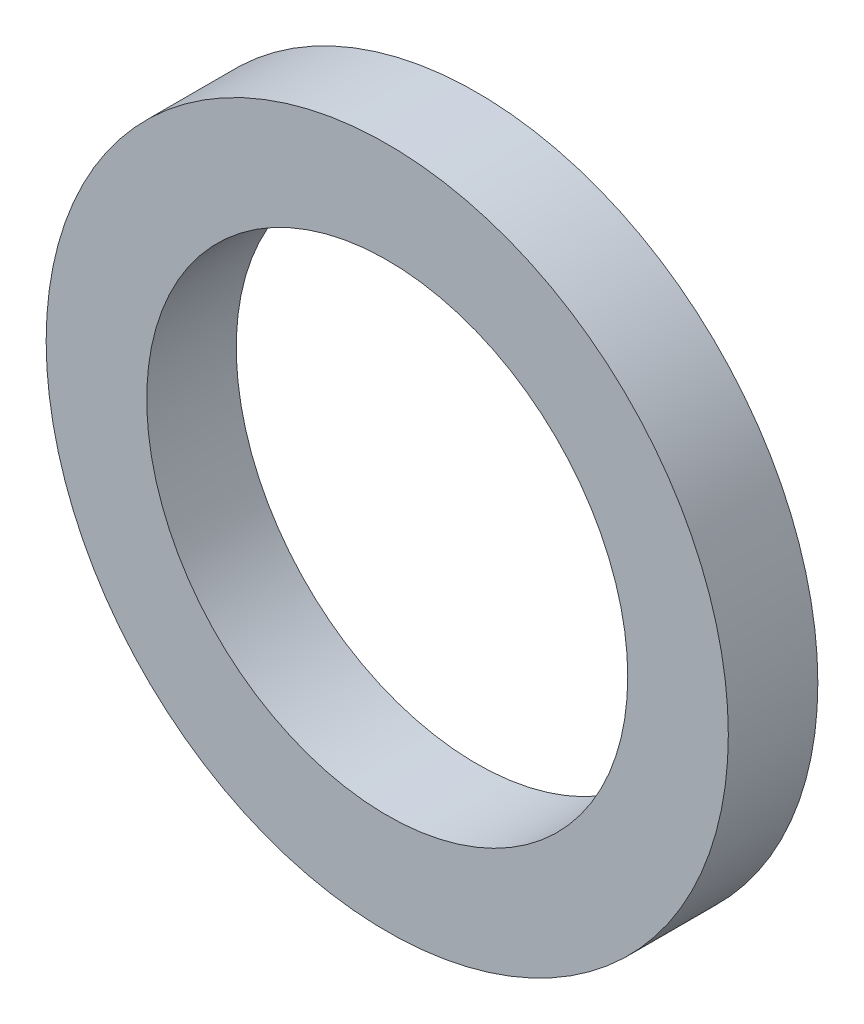
ISO-10303-21;
HEADER;
FILE_DESCRIPTION(('STEP AP214'),'2;1');
FILE_NAME('part.step','',(''),(''),'','','');
FILE_SCHEMA(('AUTOMOTIVE_DESIGN { 1 0 10303 214 1 1 1 1 }'));
ENDSEC;
DATA;
#1=APPLICATION_CONTEXT('core data for automotive mechanical design processes');
#2=APPLICATION_PROTOCOL_DEFINITION('international standard','automotive_design',2000,#1);
#3=PRODUCT_CONTEXT('',#1,'mechanical');
#4=PRODUCT('Part','Part','',(#3));
#5=PRODUCT_RELATED_PRODUCT_CATEGORY('part','',(#4));
#6=PRODUCT_DEFINITION_FORMATION('','',#4);
#7=PRODUCT_DEFINITION_CONTEXT('part definition',#1,'design');
#8=PRODUCT_DEFINITION('design','',#6,#7);
#9=PRODUCT_DEFINITION_SHAPE('','',#8);
#10=(LENGTH_UNIT() NAMED_UNIT(*) SI_UNIT(.MILLI.,.METRE.));
#11=(NAMED_UNIT(*) PLANE_ANGLE_UNIT() SI_UNIT($,.RADIAN.));
#12=(NAMED_UNIT(*) SI_UNIT($,.STERADIAN.) SOLID_ANGLE_UNIT());
#13=UNCERTAINTY_MEASURE_WITH_UNIT(LENGTH_MEASURE(1.E-05),#10,'distance_accuracy_value','');
#14=(GEOMETRIC_REPRESENTATION_CONTEXT(3) GLOBAL_UNCERTAINTY_ASSIGNED_CONTEXT((#13)) GLOBAL_UNIT_ASSIGNED_CONTEXT((#10,
#11,#12)) REPRESENTATION_CONTEXT('',''));
#15=CARTESIAN_POINT('',(0.,0.,0.));
#16=DIRECTION('',(0.,0.,1.));
#17=DIRECTION('',(1.,0.,0.));
#18=AXIS2_PLACEMENT_3D('',#15,#16,#17);
#19=CARTESIAN_POINT('',(0.,0.,1.5));
#20=DIRECTION('',(0.,0.,1.));
#21=DIRECTION('',(1.,0.,0.));
#22=AXIS2_PLACEMENT_3D('',#19,#20,#21);
#23=PLANE('',#22);
#24=CARTESIAN_POINT('',(0.,0.,1.5));
#25=DIRECTION('',(0.,0.,1.));
#26=DIRECTION('',(1.,0.,0.));
#27=AXIS2_PLACEMENT_3D('',#24,#25,#26);
#28=CIRCLE('',#27,11.43);
#29=CARTESIAN_POINT('',(11.43,0.,1.5));
#30=VERTEX_POINT('',#29);
#31=EDGE_CURVE('E10',#30,#30,#28,.T.);
#32=ORIENTED_EDGE('',*,*,#31,.T.);
#33=EDGE_LOOP('',(#32));
#34=FACE_BOUND('',#33,.T.);
#35=CARTESIAN_POINT('',(0.,0.,1.5));
#36=DIRECTION('',(0.,0.,1.));
#37=DIRECTION('',(1.,0.,0.));
#38=AXIS2_PLACEMENT_3D('',#35,#36,#37);
#39=CIRCLE('',#38,8.06);
#40=CARTESIAN_POINT('',(8.06,0.,1.5));
#41=VERTEX_POINT('',#40);
#42=EDGE_CURVE('E48',#41,#41,#39,.T.);
#43=ORIENTED_EDGE('',*,*,#42,.F.);
#44=EDGE_LOOP('',(#43));
#45=FACE_BOUND('',#44,.T.);
#46=ADVANCED_FACE('F37',(#34,#45),#23,.T.);
#47=CARTESIAN_POINT('',(0.,0.,-1.5));
#48=DIRECTION('',(0.,0.,1.));
#49=DIRECTION('',(1.,0.,0.));
#50=AXIS2_PLACEMENT_3D('',#47,#48,#49);
#51=PLANE('',#50);
#52=CARTESIAN_POINT('',(0.,0.,-1.5));
#53=DIRECTION('',(0.,0.,1.));
#54=DIRECTION('',(1.,0.,0.));
#55=AXIS2_PLACEMENT_3D('',#52,#53,#54);
#56=CIRCLE('',#55,11.43);
#57=CARTESIAN_POINT('',(11.43,0.,-1.5));
#58=VERTEX_POINT('',#57);
#59=EDGE_CURVE('E41',#58,#58,#56,.T.);
#60=ORIENTED_EDGE('',*,*,#59,.F.);
#61=EDGE_LOOP('',(#60));
#62=FACE_BOUND('',#61,.T.);
#63=CARTESIAN_POINT('',(0.,0.,-1.5));
#64=DIRECTION('',(0.,0.,1.));
#65=DIRECTION('',(1.,0.,0.));
#66=AXIS2_PLACEMENT_3D('',#63,#64,#65);
#67=CIRCLE('',#66,8.06);
#68=CARTESIAN_POINT('',(8.06,0.,-1.5));
#69=VERTEX_POINT('',#68);
#70=EDGE_CURVE('E50',#69,#69,#67,.T.);
#71=ORIENTED_EDGE('',*,*,#70,.T.);
#72=EDGE_LOOP('',(#71));
#73=FACE_BOUND('',#72,.T.);
#74=ADVANCED_FACE('F60',(#62,#73),#51,.F.);
#75=CARTESIAN_POINT('',(0.,0.,1.5));
#76=DIRECTION('',(0.,0.,-1.));
#77=DIRECTION('',(-1.,0.,0.));
#78=AXIS2_PLACEMENT_3D('',#75,#76,#77);
#79=CYLINDRICAL_SURFACE('',#78,11.43);
#80=ORIENTED_EDGE('',*,*,#31,.F.);
#81=EDGE_LOOP('',(#80));
#82=FACE_BOUND('',#81,.T.);
#83=ORIENTED_EDGE('',*,*,#59,.T.);
#84=EDGE_LOOP('',(#83));
#85=FACE_BOUND('',#84,.T.);
#86=ADVANCED_FACE('F39',(#82,#85),#79,.T.);
#87=CARTESIAN_POINT('',(0.,0.,1.5));
#88=DIRECTION('',(0.,0.,-1.));
#89=DIRECTION('',(-1.,0.,0.));
#90=AXIS2_PLACEMENT_3D('',#87,#88,#89);
#91=CYLINDRICAL_SURFACE('',#90,8.06);
#92=ORIENTED_EDGE('',*,*,#42,.T.);
#93=EDGE_LOOP('',(#92));
#94=FACE_BOUND('',#93,.T.);
#95=ORIENTED_EDGE('',*,*,#70,.F.);
#96=EDGE_LOOP('',(#95));
#97=FACE_BOUND('',#96,.T.);
#98=ADVANCED_FACE('F56',(#94,#97),#91,.F.);
#99=CLOSED_SHELL('',(#46,#74,#86,#98));
#100=MANIFOLD_SOLID_BREP('B2',#99);
#101=ADVANCED_BREP_SHAPE_REPRESENTATION('',(#18,#100),#14);
#102=SHAPE_DEFINITION_REPRESENTATION(#9,#101);
ENDSEC;
END-ISO-10303-21;
